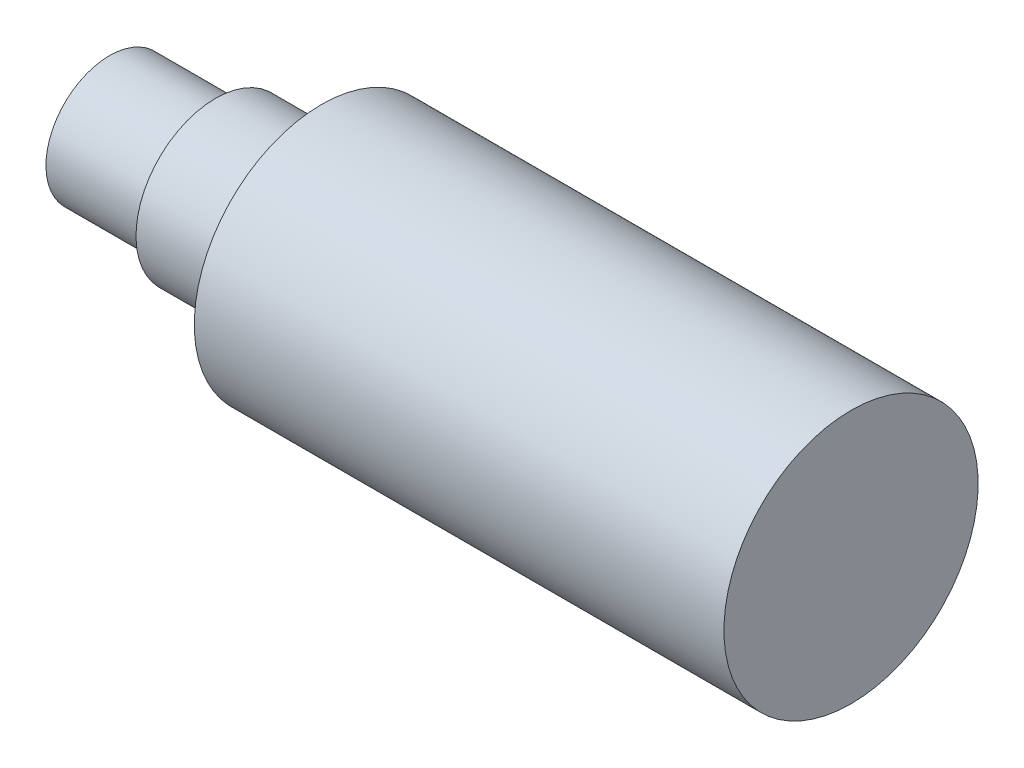
ISO-10303-21;
HEADER;
FILE_DESCRIPTION(('STEP AP214'),'2;1');
FILE_NAME('part.step','',(''),(''),'','','');
FILE_SCHEMA(('AUTOMOTIVE_DESIGN { 1 0 10303 214 1 1 1 1 }'));
ENDSEC;
DATA;
#1=APPLICATION_CONTEXT('core data for automotive mechanical design processes');
#2=APPLICATION_PROTOCOL_DEFINITION('international standard','automotive_design',2000,#1);
#3=PRODUCT_CONTEXT('',#1,'mechanical');
#4=PRODUCT('Part','Part','',(#3));
#5=PRODUCT_RELATED_PRODUCT_CATEGORY('part','',(#4));
#6=PRODUCT_DEFINITION_FORMATION('','',#4);
#7=PRODUCT_DEFINITION_CONTEXT('part definition',#1,'design');
#8=PRODUCT_DEFINITION('design','',#6,#7);
#9=PRODUCT_DEFINITION_SHAPE('','',#8);
#10=(LENGTH_UNIT() NAMED_UNIT(*) SI_UNIT(.MILLI.,.METRE.));
#11=(NAMED_UNIT(*) PLANE_ANGLE_UNIT() SI_UNIT($,.RADIAN.));
#12=(NAMED_UNIT(*) SI_UNIT($,.STERADIAN.) SOLID_ANGLE_UNIT());
#13=UNCERTAINTY_MEASURE_WITH_UNIT(LENGTH_MEASURE(1.E-05),#10,'distance_accuracy_value','');
#14=(GEOMETRIC_REPRESENTATION_CONTEXT(3) GLOBAL_UNCERTAINTY_ASSIGNED_CONTEXT((#13)) GLOBAL_UNIT_ASSIGNED_CONTEXT((#10,
#11,#12)) REPRESENTATION_CONTEXT('',''));
#15=CARTESIAN_POINT('',(0.,0.,0.));
#16=DIRECTION('',(0.,0.,1.));
#17=DIRECTION('',(1.,0.,0.));
#18=AXIS2_PLACEMENT_3D('',#15,#16,#17);
#19=CARTESIAN_POINT('',(0.,0.,0.));
#20=DIRECTION('',(-1.,0.,0.));
#21=DIRECTION('',(0.,-1.,0.));
#22=AXIS2_PLACEMENT_3D('',#19,#20,#21);
#23=PLANE('',#22);
#24=CARTESIAN_POINT('',(0.,0.,0.));
#25=DIRECTION('',(1.,0.,0.));
#26=DIRECTION('',(0.,1.,0.));
#27=AXIS2_PLACEMENT_3D('',#24,#25,#26);
#28=CIRCLE('',#27,6.);
#29=CARTESIAN_POINT('',(0.,6.,0.));
#30=VERTEX_POINT('',#29);
#31=EDGE_CURVE('E10',#30,#30,#28,.T.);
#32=ORIENTED_EDGE('',*,*,#31,.F.);
#33=EDGE_LOOP('',(#32));
#34=FACE_BOUND('',#33,.T.);
#35=ADVANCED_FACE('F41',(#34),#23,.T.);
#36=CARTESIAN_POINT('',(70.,0.,0.));
#37=DIRECTION('',(1.,0.,0.));
#38=DIRECTION('',(0.,1.,0.));
#39=AXIS2_PLACEMENT_3D('',#36,#37,#38);
#40=CYLINDRICAL_SURFACE('',#39,6.);
#41=ORIENTED_EDGE('',*,*,#31,.T.);
#42=EDGE_LOOP('',(#41));
#43=FACE_BOUND('',#42,.T.);
#44=CARTESIAN_POINT('',(10.,0.,0.));
#45=DIRECTION('',(1.,0.,0.));
#46=DIRECTION('',(0.,1.,0.));
#47=AXIS2_PLACEMENT_3D('',#44,#45,#46);
#48=CIRCLE('',#47,6.);
#49=CARTESIAN_POINT('',(10.,6.,0.));
#50=VERTEX_POINT('',#49);
#51=EDGE_CURVE('E48',#50,#50,#48,.T.);
#52=ORIENTED_EDGE('',*,*,#51,.F.);
#53=EDGE_LOOP('',(#52));
#54=FACE_BOUND('',#53,.T.);
#55=ADVANCED_FACE('F89',(#43,#54),#40,.T.);
#56=CARTESIAN_POINT('',(10.,6.,0.));
#57=DIRECTION('',(-1.,0.,0.));
#58=DIRECTION('',(0.,-1.,0.));
#59=AXIS2_PLACEMENT_3D('',#56,#57,#58);
#60=PLANE('',#59);
#61=ORIENTED_EDGE('',*,*,#51,.T.);
#62=EDGE_LOOP('',(#61));
#63=FACE_BOUND('',#62,.T.);
#64=CARTESIAN_POINT('',(10.,0.,0.));
#65=DIRECTION('',(1.,0.,0.));
#66=DIRECTION('',(0.,1.,0.));
#67=AXIS2_PLACEMENT_3D('',#64,#65,#66);
#68=CIRCLE('',#67,7.49999999999997);
#69=CARTESIAN_POINT('',(10.,7.49999999999997,0.));
#70=VERTEX_POINT('',#69);
#71=EDGE_CURVE('E53',#70,#70,#68,.T.);
#72=ORIENTED_EDGE('',*,*,#71,.F.);
#73=EDGE_LOOP('',(#72));
#74=FACE_BOUND('',#73,.T.);
#75=ADVANCED_FACE('F94',(#63,#74),#60,.T.);
#76=CARTESIAN_POINT('',(70.,0.,0.));
#77=DIRECTION('',(1.,0.,0.));
#78=DIRECTION('',(0.,1.,0.));
#79=AXIS2_PLACEMENT_3D('',#76,#77,#78);
#80=CYLINDRICAL_SURFACE('',#79,7.49999999999997);
#81=ORIENTED_EDGE('',*,*,#71,.T.);
#82=EDGE_LOOP('',(#81));
#83=FACE_BOUND('',#82,.T.);
#84=CARTESIAN_POINT('',(20.,0.,0.));
#85=DIRECTION('',(1.,0.,0.));
#86=DIRECTION('',(0.,1.,0.));
#87=AXIS2_PLACEMENT_3D('',#84,#85,#86);
#88=CIRCLE('',#87,7.49999999999996);
#89=CARTESIAN_POINT('',(20.,7.49999999999996,0.));
#90=VERTEX_POINT('',#89);
#91=EDGE_CURVE('E58',#90,#90,#88,.T.);
#92=ORIENTED_EDGE('',*,*,#91,.F.);
#93=EDGE_LOOP('',(#92));
#94=FACE_BOUND('',#93,.T.);
#95=ADVANCED_FACE('F85',(#83,#94),#80,.T.);
#96=CARTESIAN_POINT('',(20.,7.49999999999996,0.));
#97=DIRECTION('',(-1.,0.,0.));
#98=DIRECTION('',(0.,-1.,0.));
#99=AXIS2_PLACEMENT_3D('',#96,#97,#98);
#100=PLANE('',#99);
#101=ORIENTED_EDGE('',*,*,#91,.T.);
#102=EDGE_LOOP('',(#101));
#103=FACE_BOUND('',#102,.T.);
#104=CARTESIAN_POINT('',(20.,0.,0.));
#105=DIRECTION('',(1.,0.,0.));
#106=DIRECTION('',(0.,1.,0.));
#107=AXIS2_PLACEMENT_3D('',#104,#105,#106);
#108=CIRCLE('',#107,12.);
#109=CARTESIAN_POINT('',(20.,12.,0.));
#110=VERTEX_POINT('',#109);
#111=EDGE_CURVE('E64',#110,#110,#108,.T.);
#112=ORIENTED_EDGE('',*,*,#111,.F.);
#113=EDGE_LOOP('',(#112));
#114=FACE_BOUND('',#113,.T.);
#115=ADVANCED_FACE('F77',(#103,#114),#100,.T.);
#116=CARTESIAN_POINT('',(70.,0.,0.));
#117=DIRECTION('',(1.,0.,0.));
#118=DIRECTION('',(0.,1.,0.));
#119=AXIS2_PLACEMENT_3D('',#116,#117,#118);
#120=CYLINDRICAL_SURFACE('',#119,12.);
#121=ORIENTED_EDGE('',*,*,#111,.T.);
#122=EDGE_LOOP('',(#121));
#123=FACE_BOUND('',#122,.T.);
#124=CARTESIAN_POINT('',(70.,0.,0.));
#125=DIRECTION('',(1.,0.,0.));
#126=DIRECTION('',(0.,1.,0.));
#127=AXIS2_PLACEMENT_3D('',#124,#125,#126);
#128=CIRCLE('',#127,12.);
#129=CARTESIAN_POINT('',(70.,12.,0.));
#130=VERTEX_POINT('',#129);
#131=EDGE_CURVE('E68',#130,#130,#128,.T.);
#132=ORIENTED_EDGE('',*,*,#131,.F.);
#133=EDGE_LOOP('',(#132));
#134=FACE_BOUND('',#133,.T.);
#135=ADVANCED_FACE('F75',(#123,#134),#120,.T.);
#136=CARTESIAN_POINT('',(70.,12.,0.));
#137=DIRECTION('',(1.,0.,0.));
#138=DIRECTION('',(0.,1.,0.));
#139=AXIS2_PLACEMENT_3D('',#136,#137,#138);
#140=PLANE('',#139);
#141=ORIENTED_EDGE('',*,*,#131,.T.);
#142=EDGE_LOOP('',(#141));
#143=FACE_BOUND('',#142,.T.);
#144=ADVANCED_FACE('F73',(#143),#140,.T.);
#145=CLOSED_SHELL('',(#35,#55,#75,#95,#115,#135,#144));
#146=MANIFOLD_SOLID_BREP('B2',#145);
#147=ADVANCED_BREP_SHAPE_REPRESENTATION('',(#18,#146),#14);
#148=SHAPE_DEFINITION_REPRESENTATION(#9,#147);
ENDSEC;
END-ISO-10303-21;
